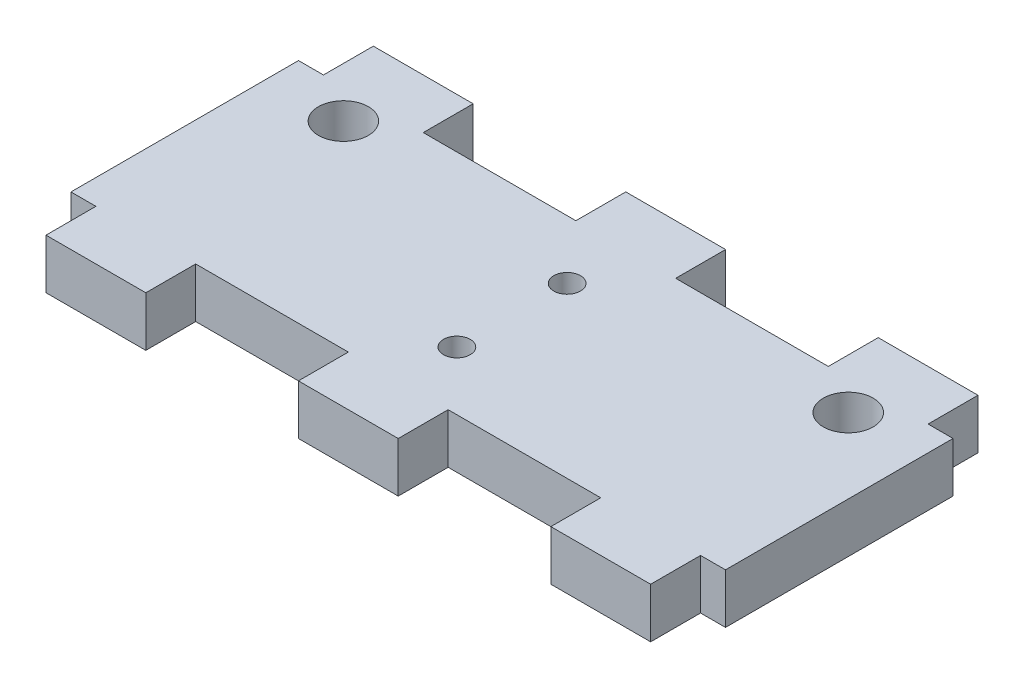
ISO-10303-21;
HEADER;
FILE_DESCRIPTION(('STEP AP214'),'2;1');
FILE_NAME('part.step','',(''),(''),'','','');
FILE_SCHEMA(('AUTOMOTIVE_DESIGN { 1 0 10303 214 1 1 1 1 }'));
ENDSEC;
DATA;
#1=APPLICATION_CONTEXT('core data for automotive mechanical design processes');
#2=APPLICATION_PROTOCOL_DEFINITION('international standard','automotive_design',2000,#1);
#3=PRODUCT_CONTEXT('',#1,'mechanical');
#4=PRODUCT('Part','Part','',(#3));
#5=PRODUCT_RELATED_PRODUCT_CATEGORY('part','',(#4));
#6=PRODUCT_DEFINITION_FORMATION('','',#4);
#7=PRODUCT_DEFINITION_CONTEXT('part definition',#1,'design');
#8=PRODUCT_DEFINITION('design','',#6,#7);
#9=PRODUCT_DEFINITION_SHAPE('','',#8);
#10=(LENGTH_UNIT() NAMED_UNIT(*) SI_UNIT(.MILLI.,.METRE.));
#11=(NAMED_UNIT(*) PLANE_ANGLE_UNIT() SI_UNIT($,.RADIAN.));
#12=(NAMED_UNIT(*) SI_UNIT($,.STERADIAN.) SOLID_ANGLE_UNIT());
#13=UNCERTAINTY_MEASURE_WITH_UNIT(LENGTH_MEASURE(1.E-05),#10,'distance_accuracy_value','');
#14=(GEOMETRIC_REPRESENTATION_CONTEXT(3) GLOBAL_UNCERTAINTY_ASSIGNED_CONTEXT((#13)) GLOBAL_UNIT_ASSIGNED_CONTEXT((#10,
#11,#12)) REPRESENTATION_CONTEXT('',''));
#15=CARTESIAN_POINT('',(0.,0.,0.));
#16=DIRECTION('',(0.,0.,1.));
#17=DIRECTION('',(1.,0.,0.));
#18=AXIS2_PLACEMENT_3D('',#15,#16,#17);
#19=CARTESIAN_POINT('',(0.,6.35,0.));
#20=DIRECTION('',(0.,-1.,0.));
#21=DIRECTION('',(0.,0.,-1.));
#22=AXIS2_PLACEMENT_3D('',#19,#20,#21);
#23=PLANE('',#22);
#24=CARTESIAN_POINT('',(-32.12084,6.35,-10.668));
#25=DIRECTION('',(0.,1.,0.));
#26=DIRECTION('',(0.,0.,1.));
#27=AXIS2_PLACEMENT_3D('',#24,#25,#26);
#28=CIRCLE('',#27,3.175);
#29=CARTESIAN_POINT('',(-32.12084,6.35,-7.493));
#30=VERTEX_POINT('',#29);
#31=EDGE_CURVE('E500',#30,#30,#28,.T.);
#32=ORIENTED_EDGE('',*,*,#31,.F.);
#33=EDGE_LOOP('',(#32));
#34=FACE_BOUND('',#33,.T.);
#35=CARTESIAN_POINT('',(0.,6.35,-7.01548000000001));
#36=DIRECTION('',(0.,1.,0.));
#37=DIRECTION('',(0.,0.,1.));
#38=AXIS2_PLACEMENT_3D('',#35,#36,#37);
#39=CIRCLE('',#38,1.70053);
#40=CARTESIAN_POINT('',(0.,6.35,-5.31495000000001));
#41=VERTEX_POINT('',#40);
#42=EDGE_CURVE('E254',#41,#41,#39,.T.);
#43=ORIENTED_EDGE('',*,*,#42,.F.);
#44=EDGE_LOOP('',(#43));
#45=FACE_BOUND('',#44,.T.);
#46=DIRECTION('',(0.,0.,1.));
#47=VECTOR('',#46,1.);
#48=CARTESIAN_POINT('',(-41.64584,6.35,14.478));
#49=LINE('',#48,#47);
#50=CARTESIAN_POINT('',(-41.64584,6.35,-14.478));
#51=VERTEX_POINT('',#50);
#52=CARTESIAN_POINT('',(-41.64584,6.35,14.478));
#53=VERTEX_POINT('',#52);
#54=EDGE_CURVE('E305',#51,#53,#49,.T.);
#55=ORIENTED_EDGE('',*,*,#54,.T.);
#56=DIRECTION('',(1.,0.,0.));
#57=VECTOR('',#56,1.);
#58=CARTESIAN_POINT('',(-41.64584,6.35,14.478));
#59=LINE('',#58,#57);
#60=CARTESIAN_POINT('',(-38.47084,6.35,14.478));
#61=VERTEX_POINT('',#60);
#62=EDGE_CURVE('E153',#53,#61,#59,.T.);
#63=ORIENTED_EDGE('',*,*,#62,.T.);
#64=DIRECTION('',(0.,0.,1.));
#65=VECTOR('',#64,1.);
#66=CARTESIAN_POINT('',(-38.47084,6.35,14.478));
#67=LINE('',#66,#65);
#68=CARTESIAN_POINT('',(-38.47084,6.35,20.828));
#69=VERTEX_POINT('',#68);
#70=EDGE_CURVE('E380',#61,#69,#67,.T.);
#71=ORIENTED_EDGE('',*,*,#70,.T.);
#72=DIRECTION('',(1.,0.,0.));
#73=VECTOR('',#72,1.);
#74=CARTESIAN_POINT('',(-38.47084,6.35,20.828));
#75=LINE('',#74,#73);
#76=CARTESIAN_POINT('',(-25.77084,6.35,20.828));
#77=VERTEX_POINT('',#76);
#78=EDGE_CURVE('E399',#69,#77,#75,.T.);
#79=ORIENTED_EDGE('',*,*,#78,.T.);
#80=DIRECTION('',(0.,0.,-1.));
#81=VECTOR('',#80,1.);
#82=CARTESIAN_POINT('',(-25.77084,6.35,20.828));
#83=LINE('',#82,#81);
#84=CARTESIAN_POINT('',(-25.77084,6.35,14.478));
#85=VERTEX_POINT('',#84);
#86=EDGE_CURVE('E396',#77,#85,#83,.T.);
#87=ORIENTED_EDGE('',*,*,#86,.T.);
#88=DIRECTION('',(1.,0.,0.));
#89=VECTOR('',#88,1.);
#90=CARTESIAN_POINT('',(-25.77084,6.35,14.478));
#91=LINE('',#90,#89);
#92=CARTESIAN_POINT('',(-6.35,6.35,14.478));
#93=VERTEX_POINT('',#92);
#94=EDGE_CURVE('E398',#85,#93,#91,.T.);
#95=ORIENTED_EDGE('',*,*,#94,.T.);
#96=DIRECTION('',(0.,0.,1.));
#97=VECTOR('',#96,1.);
#98=CARTESIAN_POINT('',(-6.35,6.35,14.478));
#99=LINE('',#98,#97);
#100=CARTESIAN_POINT('',(-6.34999999999999,6.35,20.828));
#101=VERTEX_POINT('',#100);
#102=EDGE_CURVE('E401',#93,#101,#99,.T.);
#103=ORIENTED_EDGE('',*,*,#102,.T.);
#104=DIRECTION('',(1.,0.,0.));
#105=VECTOR('',#104,1.);
#106=CARTESIAN_POINT('',(-6.34999999999999,6.35,20.828));
#107=LINE('',#106,#105);
#108=CARTESIAN_POINT('',(6.35,6.35,20.828));
#109=VERTEX_POINT('',#108);
#110=EDGE_CURVE('E407',#101,#109,#107,.T.);
#111=ORIENTED_EDGE('',*,*,#110,.T.);
#112=DIRECTION('',(0.,0.,-1.));
#113=VECTOR('',#112,1.);
#114=CARTESIAN_POINT('',(6.35,6.35,20.828));
#115=LINE('',#114,#113);
#116=CARTESIAN_POINT('',(6.35,6.35,14.478));
#117=VERTEX_POINT('',#116);
#118=EDGE_CURVE('E409',#109,#117,#115,.T.);
#119=ORIENTED_EDGE('',*,*,#118,.T.);
#120=DIRECTION('',(1.,0.,0.));
#121=VECTOR('',#120,1.);
#122=CARTESIAN_POINT('',(6.35,6.35,14.478));
#123=LINE('',#122,#121);
#124=CARTESIAN_POINT('',(25.77084,6.35,14.478));
#125=VERTEX_POINT('',#124);
#126=EDGE_CURVE('E411',#117,#125,#123,.T.);
#127=ORIENTED_EDGE('',*,*,#126,.T.);
#128=DIRECTION('',(0.,0.,1.));
#129=VECTOR('',#128,1.);
#130=CARTESIAN_POINT('',(25.77084,6.35,14.478));
#131=LINE('',#130,#129);
#132=CARTESIAN_POINT('',(25.77084,6.35,20.828));
#133=VERTEX_POINT('',#132);
#134=EDGE_CURVE('E413',#125,#133,#131,.T.);
#135=ORIENTED_EDGE('',*,*,#134,.T.);
#136=DIRECTION('',(1.,0.,0.));
#137=VECTOR('',#136,1.);
#138=CARTESIAN_POINT('',(25.77084,6.35,20.828));
#139=LINE('',#138,#137);
#140=CARTESIAN_POINT('',(38.47084,6.35,20.828));
#141=VERTEX_POINT('',#140);
#142=EDGE_CURVE('E415',#133,#141,#139,.T.);
#143=ORIENTED_EDGE('',*,*,#142,.T.);
#144=DIRECTION('',(0.,0.,-1.));
#145=VECTOR('',#144,1.);
#146=CARTESIAN_POINT('',(38.47084,6.35,20.828));
#147=LINE('',#146,#145);
#148=CARTESIAN_POINT('',(38.47084,6.35,14.478));
#149=VERTEX_POINT('',#148);
#150=EDGE_CURVE('E417',#141,#149,#147,.T.);
#151=ORIENTED_EDGE('',*,*,#150,.T.);
#152=DIRECTION('',(1.,0.,0.));
#153=VECTOR('',#152,1.);
#154=CARTESIAN_POINT('',(38.47084,6.35,14.478));
#155=LINE('',#154,#153);
#156=CARTESIAN_POINT('',(41.64584,6.35,14.478));
#157=VERTEX_POINT('',#156);
#158=EDGE_CURVE('E419',#149,#157,#155,.T.);
#159=ORIENTED_EDGE('',*,*,#158,.T.);
#160=DIRECTION('',(0.,0.,-1.));
#161=VECTOR('',#160,1.);
#162=CARTESIAN_POINT('',(41.64584,6.35,14.478));
#163=LINE('',#162,#161);
#164=CARTESIAN_POINT('',(41.64584,6.35,-14.478));
#165=VERTEX_POINT('',#164);
#166=EDGE_CURVE('E421',#157,#165,#163,.T.);
#167=ORIENTED_EDGE('',*,*,#166,.T.);
#168=DIRECTION('',(-1.,0.,0.));
#169=VECTOR('',#168,1.);
#170=CARTESIAN_POINT('',(38.47084,6.35,-14.478));
#171=LINE('',#170,#169);
#172=CARTESIAN_POINT('',(38.47084,6.35,-14.478));
#173=VERTEX_POINT('',#172);
#174=EDGE_CURVE('E423',#165,#173,#171,.T.);
#175=ORIENTED_EDGE('',*,*,#174,.T.);
#176=DIRECTION('',(0.,0.,-1.));
#177=VECTOR('',#176,1.);
#178=CARTESIAN_POINT('',(38.47084,6.35,-20.828));
#179=LINE('',#178,#177);
#180=CARTESIAN_POINT('',(38.47084,6.35,-20.828));
#181=VERTEX_POINT('',#180);
#182=EDGE_CURVE('E425',#173,#181,#179,.T.);
#183=ORIENTED_EDGE('',*,*,#182,.T.);
#184=DIRECTION('',(-1.,0.,0.));
#185=VECTOR('',#184,1.);
#186=CARTESIAN_POINT('',(25.77084,6.35,-20.828));
#187=LINE('',#186,#185);
#188=CARTESIAN_POINT('',(25.77084,6.35,-20.828));
#189=VERTEX_POINT('',#188);
#190=EDGE_CURVE('E427',#181,#189,#187,.T.);
#191=ORIENTED_EDGE('',*,*,#190,.T.);
#192=DIRECTION('',(0.,0.,1.));
#193=VECTOR('',#192,1.);
#194=CARTESIAN_POINT('',(25.77084,6.35,-14.478));
#195=LINE('',#194,#193);
#196=CARTESIAN_POINT('',(25.77084,6.35,-14.478));
#197=VERTEX_POINT('',#196);
#198=EDGE_CURVE('E429',#189,#197,#195,.T.);
#199=ORIENTED_EDGE('',*,*,#198,.T.);
#200=DIRECTION('',(-1.,0.,0.));
#201=VECTOR('',#200,1.);
#202=CARTESIAN_POINT('',(6.35,6.35,-14.478));
#203=LINE('',#202,#201);
#204=CARTESIAN_POINT('',(6.35,6.35,-14.478));
#205=VERTEX_POINT('',#204);
#206=EDGE_CURVE('E431',#197,#205,#203,.T.);
#207=ORIENTED_EDGE('',*,*,#206,.T.);
#208=DIRECTION('',(0.,0.,-1.));
#209=VECTOR('',#208,1.);
#210=CARTESIAN_POINT('',(6.34999999999999,6.35,-20.828));
#211=LINE('',#210,#209);
#212=CARTESIAN_POINT('',(6.34999999999999,6.35,-20.828));
#213=VERTEX_POINT('',#212);
#214=EDGE_CURVE('E433',#205,#213,#211,.T.);
#215=ORIENTED_EDGE('',*,*,#214,.T.);
#216=DIRECTION('',(-1.,0.,0.));
#217=VECTOR('',#216,1.);
#218=CARTESIAN_POINT('',(-6.34999999999999,6.35,-20.828));
#219=LINE('',#218,#217);
#220=CARTESIAN_POINT('',(-6.34999999999999,6.35,-20.828));
#221=VERTEX_POINT('',#220);
#222=EDGE_CURVE('E435',#213,#221,#219,.T.);
#223=ORIENTED_EDGE('',*,*,#222,.T.);
#224=DIRECTION('',(0.,0.,1.));
#225=VECTOR('',#224,1.);
#226=CARTESIAN_POINT('',(-6.35,6.35,-14.478));
#227=LINE('',#226,#225);
#228=CARTESIAN_POINT('',(-6.35,6.35,-14.478));
#229=VERTEX_POINT('',#228);
#230=EDGE_CURVE('E437',#221,#229,#227,.T.);
#231=ORIENTED_EDGE('',*,*,#230,.T.);
#232=DIRECTION('',(-1.,0.,0.));
#233=VECTOR('',#232,1.);
#234=CARTESIAN_POINT('',(-25.77084,6.35,-14.478));
#235=LINE('',#234,#233);
#236=CARTESIAN_POINT('',(-25.77084,6.35,-14.478));
#237=VERTEX_POINT('',#236);
#238=EDGE_CURVE('E439',#229,#237,#235,.T.);
#239=ORIENTED_EDGE('',*,*,#238,.T.);
#240=DIRECTION('',(0.,0.,-1.));
#241=VECTOR('',#240,1.);
#242=CARTESIAN_POINT('',(-25.77084,6.35,-20.828));
#243=LINE('',#242,#241);
#244=CARTESIAN_POINT('',(-25.77084,6.35,-20.828));
#245=VERTEX_POINT('',#244);
#246=EDGE_CURVE('E232',#237,#245,#243,.T.);
#247=ORIENTED_EDGE('',*,*,#246,.T.);
#248=DIRECTION('',(-1.,0.,0.));
#249=VECTOR('',#248,1.);
#250=CARTESIAN_POINT('',(-38.47084,6.35,-20.828));
#251=LINE('',#250,#249);
#252=CARTESIAN_POINT('',(-38.47084,6.35,-20.828));
#253=VERTEX_POINT('',#252);
#254=EDGE_CURVE('E226',#245,#253,#251,.T.);
#255=ORIENTED_EDGE('',*,*,#254,.T.);
#256=DIRECTION('',(0.,0.,1.));
#257=VECTOR('',#256,1.);
#258=CARTESIAN_POINT('',(-38.47084,6.35,-14.478));
#259=LINE('',#258,#257);
#260=CARTESIAN_POINT('',(-38.47084,6.35,-14.478));
#261=VERTEX_POINT('',#260);
#262=EDGE_CURVE('E230',#253,#261,#259,.T.);
#263=ORIENTED_EDGE('',*,*,#262,.T.);
#264=DIRECTION('',(-1.,0.,0.));
#265=VECTOR('',#264,1.);
#266=CARTESIAN_POINT('',(-41.64584,6.35,-14.478));
#267=LINE('',#266,#265);
#268=EDGE_CURVE('E50',#261,#51,#267,.T.);
#269=ORIENTED_EDGE('',*,*,#268,.T.);
#270=EDGE_LOOP('',(#55,#63,#71,#79,#87,#95,#103,#111,#119,#127,#135,#143,#151,#159,#167,#175,
#183,#191,#199,#207,#215,#223,#231,#239,#247,#255,#263,#269));
#271=FACE_BOUND('',#270,.T.);
#272=CARTESIAN_POINT('',(32.12084,6.35,-10.668));
#273=DIRECTION('',(0.,1.,0.));
#274=DIRECTION('',(0.,0.,1.));
#275=AXIS2_PLACEMENT_3D('',#272,#273,#274);
#276=CIRCLE('',#275,3.17500000000001);
#277=CARTESIAN_POINT('',(32.12084,6.35,-7.493));
#278=VERTEX_POINT('',#277);
#279=EDGE_CURVE('E506',#278,#278,#276,.T.);
#280=ORIENTED_EDGE('',*,*,#279,.F.);
#281=EDGE_LOOP('',(#280));
#282=FACE_BOUND('',#281,.T.);
#283=CARTESIAN_POINT('',(0.,6.35,7.01547999999999));
#284=DIRECTION('',(0.,1.,0.));
#285=DIRECTION('',(0.,0.,1.));
#286=AXIS2_PLACEMENT_3D('',#283,#284,#285);
#287=CIRCLE('',#286,1.70053);
#288=CARTESIAN_POINT('',(0.,6.35,8.71600999999999));
#289=VERTEX_POINT('',#288);
#290=EDGE_CURVE('E491',#289,#289,#287,.T.);
#291=ORIENTED_EDGE('',*,*,#290,.F.);
#292=EDGE_LOOP('',(#291));
#293=FACE_BOUND('',#292,.T.);
#294=ADVANCED_FACE('F33',(#34,#45,#271,#282,#293),#23,.F.);
#295=CARTESIAN_POINT('',(0.,0.,0.));
#296=DIRECTION('',(0.,-1.,0.));
#297=DIRECTION('',(0.,0.,-1.));
#298=AXIS2_PLACEMENT_3D('',#295,#296,#297);
#299=PLANE('',#298);
#300=CARTESIAN_POINT('',(-32.12084,0.,-10.668));
#301=DIRECTION('',(0.,1.,0.));
#302=DIRECTION('',(0.,0.,1.));
#303=AXIS2_PLACEMENT_3D('',#300,#301,#302);
#304=CIRCLE('',#303,3.175);
#305=CARTESIAN_POINT('',(-32.12084,0.,-7.493));
#306=VERTEX_POINT('',#305);
#307=EDGE_CURVE('E497',#306,#306,#304,.T.);
#308=ORIENTED_EDGE('',*,*,#307,.T.);
#309=EDGE_LOOP('',(#308));
#310=FACE_BOUND('',#309,.T.);
#311=CARTESIAN_POINT('',(0.,0.,-7.01548000000001));
#312=DIRECTION('',(0.,1.,0.));
#313=DIRECTION('',(0.,0.,1.));
#314=AXIS2_PLACEMENT_3D('',#311,#312,#313);
#315=CIRCLE('',#314,1.70053);
#316=CARTESIAN_POINT('',(0.,0.,-5.31495000000001));
#317=VERTEX_POINT('',#316);
#318=EDGE_CURVE('E509',#317,#317,#315,.T.);
#319=ORIENTED_EDGE('',*,*,#318,.T.);
#320=EDGE_LOOP('',(#319));
#321=FACE_BOUND('',#320,.T.);
#322=DIRECTION('',(0.,0.,1.));
#323=VECTOR('',#322,1.);
#324=CARTESIAN_POINT('',(-41.64584,0.,14.478));
#325=LINE('',#324,#323);
#326=CARTESIAN_POINT('',(-41.64584,0.,-14.478));
#327=VERTEX_POINT('',#326);
#328=CARTESIAN_POINT('',(-41.64584,0.,14.478));
#329=VERTEX_POINT('',#328);
#330=EDGE_CURVE('E250',#327,#329,#325,.T.);
#331=ORIENTED_EDGE('',*,*,#330,.F.);
#332=DIRECTION('',(-1.,0.,0.));
#333=VECTOR('',#332,1.);
#334=CARTESIAN_POINT('',(-41.64584,0.,-14.478));
#335=LINE('',#334,#333);
#336=CARTESIAN_POINT('',(-38.47084,0.,-14.478));
#337=VERTEX_POINT('',#336);
#338=EDGE_CURVE('E145',#337,#327,#335,.T.);
#339=ORIENTED_EDGE('',*,*,#338,.F.);
#340=DIRECTION('',(0.,0.,1.));
#341=VECTOR('',#340,1.);
#342=CARTESIAN_POINT('',(-38.47084,0.,-14.478));
#343=LINE('',#342,#341);
#344=CARTESIAN_POINT('',(-38.47084,0.,-20.828));
#345=VERTEX_POINT('',#344);
#346=EDGE_CURVE('E139',#345,#337,#343,.T.);
#347=ORIENTED_EDGE('',*,*,#346,.F.);
#348=DIRECTION('',(-1.,0.,0.));
#349=VECTOR('',#348,1.);
#350=CARTESIAN_POINT('',(-38.47084,0.,-20.828));
#351=LINE('',#350,#349);
#352=CARTESIAN_POINT('',(-25.77084,0.,-20.828));
#353=VERTEX_POINT('',#352);
#354=EDGE_CURVE('E240',#353,#345,#351,.T.);
#355=ORIENTED_EDGE('',*,*,#354,.F.);
#356=DIRECTION('',(0.,0.,-1.));
#357=VECTOR('',#356,1.);
#358=CARTESIAN_POINT('',(-25.77084,0.,-20.828));
#359=LINE('',#358,#357);
#360=CARTESIAN_POINT('',(-25.77084,0.,-14.478));
#361=VERTEX_POINT('',#360);
#362=EDGE_CURVE('E300',#361,#353,#359,.T.);
#363=ORIENTED_EDGE('',*,*,#362,.F.);
#364=DIRECTION('',(-1.,0.,0.));
#365=VECTOR('',#364,1.);
#366=CARTESIAN_POINT('',(-25.77084,0.,-14.478));
#367=LINE('',#366,#365);
#368=CARTESIAN_POINT('',(-6.35,0.,-14.478));
#369=VERTEX_POINT('',#368);
#370=EDGE_CURVE('E298',#369,#361,#367,.T.);
#371=ORIENTED_EDGE('',*,*,#370,.F.);
#372=DIRECTION('',(0.,0.,1.));
#373=VECTOR('',#372,1.);
#374=CARTESIAN_POINT('',(-6.35,0.,-14.478));
#375=LINE('',#374,#373);
#376=CARTESIAN_POINT('',(-6.34999999999999,0.,-20.828));
#377=VERTEX_POINT('',#376);
#378=EDGE_CURVE('E296',#377,#369,#375,.T.);
#379=ORIENTED_EDGE('',*,*,#378,.F.);
#380=DIRECTION('',(-1.,0.,0.));
#381=VECTOR('',#380,1.);
#382=CARTESIAN_POINT('',(-6.34999999999999,0.,-20.828));
#383=LINE('',#382,#381);
#384=CARTESIAN_POINT('',(6.34999999999999,0.,-20.828));
#385=VERTEX_POINT('',#384);
#386=EDGE_CURVE('E294',#385,#377,#383,.T.);
#387=ORIENTED_EDGE('',*,*,#386,.F.);
#388=DIRECTION('',(0.,0.,-1.));
#389=VECTOR('',#388,1.);
#390=CARTESIAN_POINT('',(6.34999999999999,0.,-20.828));
#391=LINE('',#390,#389);
#392=CARTESIAN_POINT('',(6.35,0.,-14.478));
#393=VERTEX_POINT('',#392);
#394=EDGE_CURVE('E292',#393,#385,#391,.T.);
#395=ORIENTED_EDGE('',*,*,#394,.F.);
#396=DIRECTION('',(-1.,0.,0.));
#397=VECTOR('',#396,1.);
#398=CARTESIAN_POINT('',(6.35,0.,-14.478));
#399=LINE('',#398,#397);
#400=CARTESIAN_POINT('',(25.77084,0.,-14.478));
#401=VERTEX_POINT('',#400);
#402=EDGE_CURVE('E290',#401,#393,#399,.T.);
#403=ORIENTED_EDGE('',*,*,#402,.F.);
#404=DIRECTION('',(0.,0.,1.));
#405=VECTOR('',#404,1.);
#406=CARTESIAN_POINT('',(25.77084,0.,-14.478));
#407=LINE('',#406,#405);
#408=CARTESIAN_POINT('',(25.77084,0.,-20.828));
#409=VERTEX_POINT('',#408);
#410=EDGE_CURVE('E288',#409,#401,#407,.T.);
#411=ORIENTED_EDGE('',*,*,#410,.F.);
#412=DIRECTION('',(-1.,0.,0.));
#413=VECTOR('',#412,1.);
#414=CARTESIAN_POINT('',(25.77084,0.,-20.828));
#415=LINE('',#414,#413);
#416=CARTESIAN_POINT('',(38.47084,0.,-20.828));
#417=VERTEX_POINT('',#416);
#418=EDGE_CURVE('E286',#417,#409,#415,.T.);
#419=ORIENTED_EDGE('',*,*,#418,.F.);
#420=DIRECTION('',(0.,0.,-1.));
#421=VECTOR('',#420,1.);
#422=CARTESIAN_POINT('',(38.47084,0.,-20.828));
#423=LINE('',#422,#421);
#424=CARTESIAN_POINT('',(38.47084,0.,-14.478));
#425=VERTEX_POINT('',#424);
#426=EDGE_CURVE('E284',#425,#417,#423,.T.);
#427=ORIENTED_EDGE('',*,*,#426,.F.);
#428=DIRECTION('',(-1.,0.,0.));
#429=VECTOR('',#428,1.);
#430=CARTESIAN_POINT('',(38.47084,0.,-14.478));
#431=LINE('',#430,#429);
#432=CARTESIAN_POINT('',(41.64584,0.,-14.478));
#433=VERTEX_POINT('',#432);
#434=EDGE_CURVE('E282',#433,#425,#431,.T.);
#435=ORIENTED_EDGE('',*,*,#434,.F.);
#436=DIRECTION('',(0.,0.,-1.));
#437=VECTOR('',#436,1.);
#438=CARTESIAN_POINT('',(41.64584,0.,14.478));
#439=LINE('',#438,#437);
#440=CARTESIAN_POINT('',(41.64584,0.,14.478));
#441=VERTEX_POINT('',#440);
#442=EDGE_CURVE('E280',#441,#433,#439,.T.);
#443=ORIENTED_EDGE('',*,*,#442,.F.);
#444=DIRECTION('',(1.,0.,0.));
#445=VECTOR('',#444,1.);
#446=CARTESIAN_POINT('',(38.47084,0.,14.478));
#447=LINE('',#446,#445);
#448=CARTESIAN_POINT('',(38.47084,0.,14.478));
#449=VERTEX_POINT('',#448);
#450=EDGE_CURVE('E278',#449,#441,#447,.T.);
#451=ORIENTED_EDGE('',*,*,#450,.F.);
#452=DIRECTION('',(0.,0.,-1.));
#453=VECTOR('',#452,1.);
#454=CARTESIAN_POINT('',(38.47084,0.,20.828));
#455=LINE('',#454,#453);
#456=CARTESIAN_POINT('',(38.47084,0.,20.828));
#457=VERTEX_POINT('',#456);
#458=EDGE_CURVE('E276',#457,#449,#455,.T.);
#459=ORIENTED_EDGE('',*,*,#458,.F.);
#460=DIRECTION('',(1.,0.,0.));
#461=VECTOR('',#460,1.);
#462=CARTESIAN_POINT('',(25.77084,0.,20.828));
#463=LINE('',#462,#461);
#464=CARTESIAN_POINT('',(25.77084,0.,20.828));
#465=VERTEX_POINT('',#464);
#466=EDGE_CURVE('E274',#465,#457,#463,.T.);
#467=ORIENTED_EDGE('',*,*,#466,.F.);
#468=DIRECTION('',(0.,0.,1.));
#469=VECTOR('',#468,1.);
#470=CARTESIAN_POINT('',(25.77084,0.,14.478));
#471=LINE('',#470,#469);
#472=CARTESIAN_POINT('',(25.77084,0.,14.478));
#473=VERTEX_POINT('',#472);
#474=EDGE_CURVE('E272',#473,#465,#471,.T.);
#475=ORIENTED_EDGE('',*,*,#474,.F.);
#476=DIRECTION('',(1.,0.,0.));
#477=VECTOR('',#476,1.);
#478=CARTESIAN_POINT('',(6.35,0.,14.478));
#479=LINE('',#478,#477);
#480=CARTESIAN_POINT('',(6.35,0.,14.478));
#481=VERTEX_POINT('',#480);
#482=EDGE_CURVE('E270',#481,#473,#479,.T.);
#483=ORIENTED_EDGE('',*,*,#482,.F.);
#484=DIRECTION('',(0.,0.,-1.));
#485=VECTOR('',#484,1.);
#486=CARTESIAN_POINT('',(6.35,0.,20.828));
#487=LINE('',#486,#485);
#488=CARTESIAN_POINT('',(6.35,0.,20.828));
#489=VERTEX_POINT('',#488);
#490=EDGE_CURVE('E268',#489,#481,#487,.T.);
#491=ORIENTED_EDGE('',*,*,#490,.F.);
#492=DIRECTION('',(1.,0.,0.));
#493=VECTOR('',#492,1.);
#494=CARTESIAN_POINT('',(-6.34999999999999,0.,20.828));
#495=LINE('',#494,#493);
#496=CARTESIAN_POINT('',(-6.34999999999999,0.,20.828));
#497=VERTEX_POINT('',#496);
#498=EDGE_CURVE('E266',#497,#489,#495,.T.);
#499=ORIENTED_EDGE('',*,*,#498,.F.);
#500=DIRECTION('',(0.,0.,1.));
#501=VECTOR('',#500,1.);
#502=CARTESIAN_POINT('',(-6.35,0.,14.478));
#503=LINE('',#502,#501);
#504=CARTESIAN_POINT('',(-6.35,0.,14.478));
#505=VERTEX_POINT('',#504);
#506=EDGE_CURVE('E264',#505,#497,#503,.T.);
#507=ORIENTED_EDGE('',*,*,#506,.F.);
#508=DIRECTION('',(1.,0.,0.));
#509=VECTOR('',#508,1.);
#510=CARTESIAN_POINT('',(-25.77084,0.,14.478));
#511=LINE('',#510,#509);
#512=CARTESIAN_POINT('',(-25.77084,0.,14.478));
#513=VERTEX_POINT('',#512);
#514=EDGE_CURVE('E262',#513,#505,#511,.T.);
#515=ORIENTED_EDGE('',*,*,#514,.F.);
#516=DIRECTION('',(0.,0.,-1.));
#517=VECTOR('',#516,1.);
#518=CARTESIAN_POINT('',(-25.77084,0.,20.828));
#519=LINE('',#518,#517);
#520=CARTESIAN_POINT('',(-25.77084,0.,20.828));
#521=VERTEX_POINT('',#520);
#522=EDGE_CURVE('E260',#521,#513,#519,.T.);
#523=ORIENTED_EDGE('',*,*,#522,.F.);
#524=DIRECTION('',(1.,0.,0.));
#525=VECTOR('',#524,1.);
#526=CARTESIAN_POINT('',(-38.47084,0.,20.828));
#527=LINE('',#526,#525);
#528=CARTESIAN_POINT('',(-38.47084,0.,20.828));
#529=VERTEX_POINT('',#528);
#530=EDGE_CURVE('E258',#529,#521,#527,.T.);
#531=ORIENTED_EDGE('',*,*,#530,.F.);
#532=DIRECTION('',(0.,0.,1.));
#533=VECTOR('',#532,1.);
#534=CARTESIAN_POINT('',(-38.47084,0.,14.478));
#535=LINE('',#534,#533);
#536=CARTESIAN_POINT('',(-38.47084,0.,14.478));
#537=VERTEX_POINT('',#536);
#538=EDGE_CURVE('E256',#537,#529,#535,.T.);
#539=ORIENTED_EDGE('',*,*,#538,.F.);
#540=DIRECTION('',(1.,0.,0.));
#541=VECTOR('',#540,1.);
#542=CARTESIAN_POINT('',(-41.64584,0.,14.478));
#543=LINE('',#542,#541);
#544=EDGE_CURVE('E253',#329,#537,#543,.T.);
#545=ORIENTED_EDGE('',*,*,#544,.F.);
#546=EDGE_LOOP('',(#331,#339,#347,#355,#363,#371,#379,#387,#395,#403,#411,#419,#427,#435,#443,
#451,#459,#467,#475,#483,#491,#499,#507,#515,#523,#531,#539,#545));
#547=FACE_BOUND('',#546,.T.);
#548=CARTESIAN_POINT('',(32.12084,0.,-10.668));
#549=DIRECTION('',(0.,1.,0.));
#550=DIRECTION('',(0.,0.,1.));
#551=AXIS2_PLACEMENT_3D('',#548,#549,#550);
#552=CIRCLE('',#551,3.17500000000001);
#553=CARTESIAN_POINT('',(32.12084,0.,-7.493));
#554=VERTEX_POINT('',#553);
#555=EDGE_CURVE('E503',#554,#554,#552,.T.);
#556=ORIENTED_EDGE('',*,*,#555,.T.);
#557=EDGE_LOOP('',(#556));
#558=FACE_BOUND('',#557,.T.);
#559=CARTESIAN_POINT('',(0.,0.,7.01547999999999));
#560=DIRECTION('',(0.,1.,0.));
#561=DIRECTION('',(0.,0.,1.));
#562=AXIS2_PLACEMENT_3D('',#559,#560,#561);
#563=CIRCLE('',#562,1.70053);
#564=CARTESIAN_POINT('',(0.,0.,8.71600999999999));
#565=VERTEX_POINT('',#564);
#566=EDGE_CURVE('E494',#565,#565,#563,.T.);
#567=ORIENTED_EDGE('',*,*,#566,.T.);
#568=EDGE_LOOP('',(#567));
#569=FACE_BOUND('',#568,.T.);
#570=ADVANCED_FACE('F384',(#310,#321,#547,#558,#569),#299,.T.);
#571=CARTESIAN_POINT('',(-41.64584,6.35,14.478));
#572=DIRECTION('',(1.,0.,0.));
#573=DIRECTION('',(0.,0.,-1.));
#574=AXIS2_PLACEMENT_3D('',#571,#572,#573);
#575=PLANE('',#574);
#576=ORIENTED_EDGE('',*,*,#330,.T.);
#577=DIRECTION('',(0.,-1.,0.));
#578=VECTOR('',#577,1.);
#579=CARTESIAN_POINT('',(-41.64584,6.35,14.478));
#580=LINE('',#579,#578);
#581=EDGE_CURVE('E11',#53,#329,#580,.T.);
#582=ORIENTED_EDGE('',*,*,#581,.F.);
#583=ORIENTED_EDGE('',*,*,#54,.F.);
#584=DIRECTION('',(0.,-1.,0.));
#585=VECTOR('',#584,1.);
#586=CARTESIAN_POINT('',(-41.64584,6.35,-14.478));
#587=LINE('',#586,#585);
#588=EDGE_CURVE('E246',#51,#327,#587,.T.);
#589=ORIENTED_EDGE('',*,*,#588,.T.);
#590=EDGE_LOOP('',(#576,#582,#583,#589));
#591=FACE_BOUND('',#590,.T.);
#592=ADVANCED_FACE('F35',(#591),#575,.F.);
#593=CARTESIAN_POINT('',(-41.64584,6.35,14.478));
#594=DIRECTION('',(0.,0.,-1.));
#595=DIRECTION('',(-1.,0.,0.));
#596=AXIS2_PLACEMENT_3D('',#593,#594,#595);
#597=PLANE('',#596);
#598=ORIENTED_EDGE('',*,*,#544,.T.);
#599=DIRECTION('',(0.,-1.,0.));
#600=VECTOR('',#599,1.);
#601=CARTESIAN_POINT('',(-38.47084,6.35,14.478));
#602=LINE('',#601,#600);
#603=EDGE_CURVE('E42',#61,#537,#602,.T.);
#604=ORIENTED_EDGE('',*,*,#603,.F.);
#605=ORIENTED_EDGE('',*,*,#62,.F.);
#606=ORIENTED_EDGE('',*,*,#581,.T.);
#607=EDGE_LOOP('',(#598,#604,#605,#606));
#608=FACE_BOUND('',#607,.T.);
#609=ADVANCED_FACE('F778',(#608),#597,.F.);
#610=CARTESIAN_POINT('',(-38.47084,6.35,14.478));
#611=DIRECTION('',(1.,0.,0.));
#612=DIRECTION('',(0.,0.,-1.));
#613=AXIS2_PLACEMENT_3D('',#610,#611,#612);
#614=PLANE('',#613);
#615=ORIENTED_EDGE('',*,*,#538,.T.);
#616=DIRECTION('',(0.,-1.,0.));
#617=VECTOR('',#616,1.);
#618=CARTESIAN_POINT('',(-38.47084,6.35,20.828));
#619=LINE('',#618,#617);
#620=EDGE_CURVE('E372',#69,#529,#619,.T.);
#621=ORIENTED_EDGE('',*,*,#620,.F.);
#622=ORIENTED_EDGE('',*,*,#70,.F.);
#623=ORIENTED_EDGE('',*,*,#603,.T.);
#624=EDGE_LOOP('',(#615,#621,#622,#623));
#625=FACE_BOUND('',#624,.T.);
#626=ADVANCED_FACE('F378',(#625),#614,.F.);
#627=CARTESIAN_POINT('',(-38.47084,6.35,20.828));
#628=DIRECTION('',(0.,0.,-1.));
#629=DIRECTION('',(-1.,0.,0.));
#630=AXIS2_PLACEMENT_3D('',#627,#628,#629);
#631=PLANE('',#630);
#632=ORIENTED_EDGE('',*,*,#530,.T.);
#633=DIRECTION('',(0.,-1.,0.));
#634=VECTOR('',#633,1.);
#635=CARTESIAN_POINT('',(-25.77084,6.35,20.828));
#636=LINE('',#635,#634);
#637=EDGE_CURVE('E369',#77,#521,#636,.T.);
#638=ORIENTED_EDGE('',*,*,#637,.F.);
#639=ORIENTED_EDGE('',*,*,#78,.F.);
#640=ORIENTED_EDGE('',*,*,#620,.T.);
#641=EDGE_LOOP('',(#632,#638,#639,#640));
#642=FACE_BOUND('',#641,.T.);
#643=ADVANCED_FACE('F390',(#642),#631,.F.);
#644=CARTESIAN_POINT('',(-25.77084,6.35,20.828));
#645=DIRECTION('',(-1.,0.,0.));
#646=DIRECTION('',(0.,0.,1.));
#647=AXIS2_PLACEMENT_3D('',#644,#645,#646);
#648=PLANE('',#647);
#649=ORIENTED_EDGE('',*,*,#522,.T.);
#650=DIRECTION('',(0.,-1.,0.));
#651=VECTOR('',#650,1.);
#652=CARTESIAN_POINT('',(-25.77084,6.35,14.478));
#653=LINE('',#652,#651);
#654=EDGE_CURVE('E366',#85,#513,#653,.T.);
#655=ORIENTED_EDGE('',*,*,#654,.F.);
#656=ORIENTED_EDGE('',*,*,#86,.F.);
#657=ORIENTED_EDGE('',*,*,#637,.T.);
#658=EDGE_LOOP('',(#649,#655,#656,#657));
#659=FACE_BOUND('',#658,.T.);
#660=ADVANCED_FACE('F394',(#659),#648,.F.);
#661=CARTESIAN_POINT('',(-25.77084,6.35,14.478));
#662=DIRECTION('',(0.,0.,-1.));
#663=DIRECTION('',(-1.,0.,0.));
#664=AXIS2_PLACEMENT_3D('',#661,#662,#663);
#665=PLANE('',#664);
#666=ORIENTED_EDGE('',*,*,#514,.T.);
#667=DIRECTION('',(0.,-1.,0.));
#668=VECTOR('',#667,1.);
#669=CARTESIAN_POINT('',(-6.35,6.35,14.478));
#670=LINE('',#669,#668);
#671=EDGE_CURVE('E363',#93,#505,#670,.T.);
#672=ORIENTED_EDGE('',*,*,#671,.F.);
#673=ORIENTED_EDGE('',*,*,#94,.F.);
#674=ORIENTED_EDGE('',*,*,#654,.T.);
#675=EDGE_LOOP('',(#666,#672,#673,#674));
#676=FACE_BOUND('',#675,.T.);
#677=ADVANCED_FACE('F743',(#676),#665,.F.);
#678=CARTESIAN_POINT('',(-6.35,6.35,14.478));
#679=DIRECTION('',(1.,0.,0.));
#680=DIRECTION('',(0.,0.,-1.));
#681=AXIS2_PLACEMENT_3D('',#678,#679,#680);
#682=PLANE('',#681);
#683=ORIENTED_EDGE('',*,*,#506,.T.);
#684=DIRECTION('',(0.,-1.,0.));
#685=VECTOR('',#684,1.);
#686=CARTESIAN_POINT('',(-6.34999999999999,6.35,20.828));
#687=LINE('',#686,#685);
#688=EDGE_CURVE('E360',#101,#497,#687,.T.);
#689=ORIENTED_EDGE('',*,*,#688,.F.);
#690=ORIENTED_EDGE('',*,*,#102,.F.);
#691=ORIENTED_EDGE('',*,*,#671,.T.);
#692=EDGE_LOOP('',(#683,#689,#690,#691));
#693=FACE_BOUND('',#692,.T.);
#694=ADVANCED_FACE('F733',(#693),#682,.F.);
#695=CARTESIAN_POINT('',(-6.34999999999999,6.35,20.828));
#696=DIRECTION('',(0.,0.,-1.));
#697=DIRECTION('',(-1.,0.,0.));
#698=AXIS2_PLACEMENT_3D('',#695,#696,#697);
#699=PLANE('',#698);
#700=ORIENTED_EDGE('',*,*,#498,.T.);
#701=DIRECTION('',(0.,-1.,0.));
#702=VECTOR('',#701,1.);
#703=CARTESIAN_POINT('',(6.35,6.35,20.828));
#704=LINE('',#703,#702);
#705=EDGE_CURVE('E357',#109,#489,#704,.T.);
#706=ORIENTED_EDGE('',*,*,#705,.F.);
#707=ORIENTED_EDGE('',*,*,#110,.F.);
#708=ORIENTED_EDGE('',*,*,#688,.T.);
#709=EDGE_LOOP('',(#700,#706,#707,#708));
#710=FACE_BOUND('',#709,.T.);
#711=ADVANCED_FACE('F723',(#710),#699,.F.);
#712=CARTESIAN_POINT('',(6.35,6.35,20.828));
#713=DIRECTION('',(-1.,0.,0.));
#714=DIRECTION('',(0.,0.,1.));
#715=AXIS2_PLACEMENT_3D('',#712,#713,#714);
#716=PLANE('',#715);
#717=ORIENTED_EDGE('',*,*,#490,.T.);
#718=DIRECTION('',(0.,-1.,0.));
#719=VECTOR('',#718,1.);
#720=CARTESIAN_POINT('',(6.35,6.35,14.478));
#721=LINE('',#720,#719);
#722=EDGE_CURVE('E354',#117,#481,#721,.T.);
#723=ORIENTED_EDGE('',*,*,#722,.F.);
#724=ORIENTED_EDGE('',*,*,#118,.F.);
#725=ORIENTED_EDGE('',*,*,#705,.T.);
#726=EDGE_LOOP('',(#717,#723,#724,#725));
#727=FACE_BOUND('',#726,.T.);
#728=ADVANCED_FACE('F713',(#727),#716,.F.);
#729=CARTESIAN_POINT('',(6.35,6.35,14.478));
#730=DIRECTION('',(0.,0.,-1.));
#731=DIRECTION('',(-1.,0.,0.));
#732=AXIS2_PLACEMENT_3D('',#729,#730,#731);
#733=PLANE('',#732);
#734=ORIENTED_EDGE('',*,*,#482,.T.);
#735=DIRECTION('',(0.,-1.,0.));
#736=VECTOR('',#735,1.);
#737=CARTESIAN_POINT('',(25.77084,6.35,14.478));
#738=LINE('',#737,#736);
#739=EDGE_CURVE('E351',#125,#473,#738,.T.);
#740=ORIENTED_EDGE('',*,*,#739,.F.);
#741=ORIENTED_EDGE('',*,*,#126,.F.);
#742=ORIENTED_EDGE('',*,*,#722,.T.);
#743=EDGE_LOOP('',(#734,#740,#741,#742));
#744=FACE_BOUND('',#743,.T.);
#745=ADVANCED_FACE('F703',(#744),#733,.F.);
#746=CARTESIAN_POINT('',(25.77084,6.35,14.478));
#747=DIRECTION('',(1.,0.,0.));
#748=DIRECTION('',(0.,0.,-1.));
#749=AXIS2_PLACEMENT_3D('',#746,#747,#748);
#750=PLANE('',#749);
#751=ORIENTED_EDGE('',*,*,#474,.T.);
#752=DIRECTION('',(0.,-1.,0.));
#753=VECTOR('',#752,1.);
#754=CARTESIAN_POINT('',(25.77084,6.35,20.828));
#755=LINE('',#754,#753);
#756=EDGE_CURVE('E348',#133,#465,#755,.T.);
#757=ORIENTED_EDGE('',*,*,#756,.F.);
#758=ORIENTED_EDGE('',*,*,#134,.F.);
#759=ORIENTED_EDGE('',*,*,#739,.T.);
#760=EDGE_LOOP('',(#751,#757,#758,#759));
#761=FACE_BOUND('',#760,.T.);
#762=ADVANCED_FACE('F693',(#761),#750,.F.);
#763=CARTESIAN_POINT('',(25.77084,6.35,20.828));
#764=DIRECTION('',(0.,0.,-1.));
#765=DIRECTION('',(-1.,0.,0.));
#766=AXIS2_PLACEMENT_3D('',#763,#764,#765);
#767=PLANE('',#766);
#768=ORIENTED_EDGE('',*,*,#466,.T.);
#769=DIRECTION('',(0.,-1.,0.));
#770=VECTOR('',#769,1.);
#771=CARTESIAN_POINT('',(38.47084,6.35,20.828));
#772=LINE('',#771,#770);
#773=EDGE_CURVE('E345',#141,#457,#772,.T.);
#774=ORIENTED_EDGE('',*,*,#773,.F.);
#775=ORIENTED_EDGE('',*,*,#142,.F.);
#776=ORIENTED_EDGE('',*,*,#756,.T.);
#777=EDGE_LOOP('',(#768,#774,#775,#776));
#778=FACE_BOUND('',#777,.T.);
#779=ADVANCED_FACE('F683',(#778),#767,.F.);
#780=CARTESIAN_POINT('',(38.47084,6.35,20.828));
#781=DIRECTION('',(-1.,0.,0.));
#782=DIRECTION('',(0.,0.,1.));
#783=AXIS2_PLACEMENT_3D('',#780,#781,#782);
#784=PLANE('',#783);
#785=ORIENTED_EDGE('',*,*,#458,.T.);
#786=DIRECTION('',(0.,-1.,0.));
#787=VECTOR('',#786,1.);
#788=CARTESIAN_POINT('',(38.47084,6.35,14.478));
#789=LINE('',#788,#787);
#790=EDGE_CURVE('E342',#149,#449,#789,.T.);
#791=ORIENTED_EDGE('',*,*,#790,.F.);
#792=ORIENTED_EDGE('',*,*,#150,.F.);
#793=ORIENTED_EDGE('',*,*,#773,.T.);
#794=EDGE_LOOP('',(#785,#791,#792,#793));
#795=FACE_BOUND('',#794,.T.);
#796=ADVANCED_FACE('F673',(#795),#784,.F.);
#797=CARTESIAN_POINT('',(38.47084,6.35,14.478));
#798=DIRECTION('',(0.,0.,-1.));
#799=DIRECTION('',(-1.,0.,0.));
#800=AXIS2_PLACEMENT_3D('',#797,#798,#799);
#801=PLANE('',#800);
#802=ORIENTED_EDGE('',*,*,#450,.T.);
#803=DIRECTION('',(0.,-1.,0.));
#804=VECTOR('',#803,1.);
#805=CARTESIAN_POINT('',(41.64584,6.35,14.478));
#806=LINE('',#805,#804);
#807=EDGE_CURVE('E339',#157,#441,#806,.T.);
#808=ORIENTED_EDGE('',*,*,#807,.F.);
#809=ORIENTED_EDGE('',*,*,#158,.F.);
#810=ORIENTED_EDGE('',*,*,#790,.T.);
#811=EDGE_LOOP('',(#802,#808,#809,#810));
#812=FACE_BOUND('',#811,.T.);
#813=ADVANCED_FACE('F663',(#812),#801,.F.);
#814=CARTESIAN_POINT('',(41.64584,6.35,14.478));
#815=DIRECTION('',(-1.,0.,0.));
#816=DIRECTION('',(0.,0.,1.));
#817=AXIS2_PLACEMENT_3D('',#814,#815,#816);
#818=PLANE('',#817);
#819=ORIENTED_EDGE('',*,*,#442,.T.);
#820=DIRECTION('',(0.,-1.,0.));
#821=VECTOR('',#820,1.);
#822=CARTESIAN_POINT('',(41.64584,6.35,-14.478));
#823=LINE('',#822,#821);
#824=EDGE_CURVE('E336',#165,#433,#823,.T.);
#825=ORIENTED_EDGE('',*,*,#824,.F.);
#826=ORIENTED_EDGE('',*,*,#166,.F.);
#827=ORIENTED_EDGE('',*,*,#807,.T.);
#828=EDGE_LOOP('',(#819,#825,#826,#827));
#829=FACE_BOUND('',#828,.T.);
#830=ADVANCED_FACE('F653',(#829),#818,.F.);
#831=CARTESIAN_POINT('',(38.47084,6.35,-14.478));
#832=DIRECTION('',(0.,0.,1.));
#833=DIRECTION('',(1.,0.,0.));
#834=AXIS2_PLACEMENT_3D('',#831,#832,#833);
#835=PLANE('',#834);
#836=ORIENTED_EDGE('',*,*,#434,.T.);
#837=DIRECTION('',(0.,-1.,0.));
#838=VECTOR('',#837,1.);
#839=CARTESIAN_POINT('',(38.47084,6.35,-14.478));
#840=LINE('',#839,#838);
#841=EDGE_CURVE('E333',#173,#425,#840,.T.);
#842=ORIENTED_EDGE('',*,*,#841,.F.);
#843=ORIENTED_EDGE('',*,*,#174,.F.);
#844=ORIENTED_EDGE('',*,*,#824,.T.);
#845=EDGE_LOOP('',(#836,#842,#843,#844));
#846=FACE_BOUND('',#845,.T.);
#847=ADVANCED_FACE('F643',(#846),#835,.F.);
#848=CARTESIAN_POINT('',(38.47084,6.35,-20.828));
#849=DIRECTION('',(-1.,0.,0.));
#850=DIRECTION('',(0.,0.,1.));
#851=AXIS2_PLACEMENT_3D('',#848,#849,#850);
#852=PLANE('',#851);
#853=ORIENTED_EDGE('',*,*,#426,.T.);
#854=DIRECTION('',(0.,-1.,0.));
#855=VECTOR('',#854,1.);
#856=CARTESIAN_POINT('',(38.47084,6.35,-20.828));
#857=LINE('',#856,#855);
#858=EDGE_CURVE('E330',#181,#417,#857,.T.);
#859=ORIENTED_EDGE('',*,*,#858,.F.);
#860=ORIENTED_EDGE('',*,*,#182,.F.);
#861=ORIENTED_EDGE('',*,*,#841,.T.);
#862=EDGE_LOOP('',(#853,#859,#860,#861));
#863=FACE_BOUND('',#862,.T.);
#864=ADVANCED_FACE('F633',(#863),#852,.F.);
#865=CARTESIAN_POINT('',(25.77084,6.35,-20.828));
#866=DIRECTION('',(0.,0.,1.));
#867=DIRECTION('',(1.,0.,0.));
#868=AXIS2_PLACEMENT_3D('',#865,#866,#867);
#869=PLANE('',#868);
#870=ORIENTED_EDGE('',*,*,#418,.T.);
#871=DIRECTION('',(0.,-1.,0.));
#872=VECTOR('',#871,1.);
#873=CARTESIAN_POINT('',(25.77084,6.35,-20.828));
#874=LINE('',#873,#872);
#875=EDGE_CURVE('E327',#189,#409,#874,.T.);
#876=ORIENTED_EDGE('',*,*,#875,.F.);
#877=ORIENTED_EDGE('',*,*,#190,.F.);
#878=ORIENTED_EDGE('',*,*,#858,.T.);
#879=EDGE_LOOP('',(#870,#876,#877,#878));
#880=FACE_BOUND('',#879,.T.);
#881=ADVANCED_FACE('F623',(#880),#869,.F.);
#882=CARTESIAN_POINT('',(25.77084,6.35,-14.478));
#883=DIRECTION('',(1.,0.,0.));
#884=DIRECTION('',(0.,0.,-1.));
#885=AXIS2_PLACEMENT_3D('',#882,#883,#884);
#886=PLANE('',#885);
#887=ORIENTED_EDGE('',*,*,#410,.T.);
#888=DIRECTION('',(0.,-1.,0.));
#889=VECTOR('',#888,1.);
#890=CARTESIAN_POINT('',(25.77084,6.35,-14.478));
#891=LINE('',#890,#889);
#892=EDGE_CURVE('E324',#197,#401,#891,.T.);
#893=ORIENTED_EDGE('',*,*,#892,.F.);
#894=ORIENTED_EDGE('',*,*,#198,.F.);
#895=ORIENTED_EDGE('',*,*,#875,.T.);
#896=EDGE_LOOP('',(#887,#893,#894,#895));
#897=FACE_BOUND('',#896,.T.);
#898=ADVANCED_FACE('F613',(#897),#886,.F.);
#899=CARTESIAN_POINT('',(6.35,6.35,-14.478));
#900=DIRECTION('',(0.,0.,1.));
#901=DIRECTION('',(1.,0.,0.));
#902=AXIS2_PLACEMENT_3D('',#899,#900,#901);
#903=PLANE('',#902);
#904=ORIENTED_EDGE('',*,*,#402,.T.);
#905=DIRECTION('',(0.,-1.,0.));
#906=VECTOR('',#905,1.);
#907=CARTESIAN_POINT('',(6.35,6.35,-14.478));
#908=LINE('',#907,#906);
#909=EDGE_CURVE('E321',#205,#393,#908,.T.);
#910=ORIENTED_EDGE('',*,*,#909,.F.);
#911=ORIENTED_EDGE('',*,*,#206,.F.);
#912=ORIENTED_EDGE('',*,*,#892,.T.);
#913=EDGE_LOOP('',(#904,#910,#911,#912));
#914=FACE_BOUND('',#913,.T.);
#915=ADVANCED_FACE('F603',(#914),#903,.F.);
#916=CARTESIAN_POINT('',(6.34999999999999,6.35,-20.828));
#917=DIRECTION('',(-1.,0.,0.));
#918=DIRECTION('',(0.,0.,1.));
#919=AXIS2_PLACEMENT_3D('',#916,#917,#918);
#920=PLANE('',#919);
#921=ORIENTED_EDGE('',*,*,#394,.T.);
#922=DIRECTION('',(0.,-1.,0.));
#923=VECTOR('',#922,1.);
#924=CARTESIAN_POINT('',(6.34999999999999,6.35,-20.828));
#925=LINE('',#924,#923);
#926=EDGE_CURVE('E318',#213,#385,#925,.T.);
#927=ORIENTED_EDGE('',*,*,#926,.F.);
#928=ORIENTED_EDGE('',*,*,#214,.F.);
#929=ORIENTED_EDGE('',*,*,#909,.T.);
#930=EDGE_LOOP('',(#921,#927,#928,#929));
#931=FACE_BOUND('',#930,.T.);
#932=ADVANCED_FACE('F593',(#931),#920,.F.);
#933=CARTESIAN_POINT('',(-6.34999999999999,6.35,-20.828));
#934=DIRECTION('',(0.,0.,1.));
#935=DIRECTION('',(1.,0.,0.));
#936=AXIS2_PLACEMENT_3D('',#933,#934,#935);
#937=PLANE('',#936);
#938=ORIENTED_EDGE('',*,*,#386,.T.);
#939=DIRECTION('',(0.,-1.,0.));
#940=VECTOR('',#939,1.);
#941=CARTESIAN_POINT('',(-6.34999999999999,6.35,-20.828));
#942=LINE('',#941,#940);
#943=EDGE_CURVE('E315',#221,#377,#942,.T.);
#944=ORIENTED_EDGE('',*,*,#943,.F.);
#945=ORIENTED_EDGE('',*,*,#222,.F.);
#946=ORIENTED_EDGE('',*,*,#926,.T.);
#947=EDGE_LOOP('',(#938,#944,#945,#946));
#948=FACE_BOUND('',#947,.T.);
#949=ADVANCED_FACE('F583',(#948),#937,.F.);
#950=CARTESIAN_POINT('',(-6.35,6.35,-14.478));
#951=DIRECTION('',(1.,0.,0.));
#952=DIRECTION('',(0.,0.,-1.));
#953=AXIS2_PLACEMENT_3D('',#950,#951,#952);
#954=PLANE('',#953);
#955=ORIENTED_EDGE('',*,*,#378,.T.);
#956=DIRECTION('',(0.,-1.,0.));
#957=VECTOR('',#956,1.);
#958=CARTESIAN_POINT('',(-6.35,6.35,-14.478));
#959=LINE('',#958,#957);
#960=EDGE_CURVE('E312',#229,#369,#959,.T.);
#961=ORIENTED_EDGE('',*,*,#960,.F.);
#962=ORIENTED_EDGE('',*,*,#230,.F.);
#963=ORIENTED_EDGE('',*,*,#943,.T.);
#964=EDGE_LOOP('',(#955,#961,#962,#963));
#965=FACE_BOUND('',#964,.T.);
#966=ADVANCED_FACE('F574',(#965),#954,.F.);
#967=CARTESIAN_POINT('',(-25.77084,6.35,-14.478));
#968=DIRECTION('',(0.,0.,1.));
#969=DIRECTION('',(1.,0.,0.));
#970=AXIS2_PLACEMENT_3D('',#967,#968,#969);
#971=PLANE('',#970);
#972=ORIENTED_EDGE('',*,*,#370,.T.);
#973=DIRECTION('',(0.,-1.,0.));
#974=VECTOR('',#973,1.);
#975=CARTESIAN_POINT('',(-25.77084,6.35,-14.478));
#976=LINE('',#975,#974);
#977=EDGE_CURVE('E309',#237,#361,#976,.T.);
#978=ORIENTED_EDGE('',*,*,#977,.F.);
#979=ORIENTED_EDGE('',*,*,#238,.F.);
#980=ORIENTED_EDGE('',*,*,#960,.T.);
#981=EDGE_LOOP('',(#972,#978,#979,#980));
#982=FACE_BOUND('',#981,.T.);
#983=ADVANCED_FACE('F445',(#982),#971,.F.);
#984=CARTESIAN_POINT('',(-25.77084,6.35,-20.828));
#985=DIRECTION('',(-1.,0.,0.));
#986=DIRECTION('',(0.,0.,1.));
#987=AXIS2_PLACEMENT_3D('',#984,#985,#986);
#988=PLANE('',#987);
#989=ORIENTED_EDGE('',*,*,#362,.T.);
#990=DIRECTION('',(0.,-1.,0.));
#991=VECTOR('',#990,1.);
#992=CARTESIAN_POINT('',(-25.77084,6.35,-20.828));
#993=LINE('',#992,#991);
#994=EDGE_CURVE('E241',#245,#353,#993,.T.);
#995=ORIENTED_EDGE('',*,*,#994,.F.);
#996=ORIENTED_EDGE('',*,*,#246,.F.);
#997=ORIENTED_EDGE('',*,*,#977,.T.);
#998=EDGE_LOOP('',(#989,#995,#996,#997));
#999=FACE_BOUND('',#998,.T.);
#1000=ADVANCED_FACE('F449',(#999),#988,.F.);
#1001=CARTESIAN_POINT('',(-38.47084,6.35,-20.828));
#1002=DIRECTION('',(0.,0.,1.));
#1003=DIRECTION('',(1.,0.,0.));
#1004=AXIS2_PLACEMENT_3D('',#1001,#1002,#1003);
#1005=PLANE('',#1004);
#1006=ORIENTED_EDGE('',*,*,#354,.T.);
#1007=DIRECTION('',(0.,-1.,0.));
#1008=VECTOR('',#1007,1.);
#1009=CARTESIAN_POINT('',(-38.47084,6.35,-20.828));
#1010=LINE('',#1009,#1008);
#1011=EDGE_CURVE('E237',#253,#345,#1010,.T.);
#1012=ORIENTED_EDGE('',*,*,#1011,.F.);
#1013=ORIENTED_EDGE('',*,*,#254,.F.);
#1014=ORIENTED_EDGE('',*,*,#994,.T.);
#1015=EDGE_LOOP('',(#1006,#1012,#1013,#1014));
#1016=FACE_BOUND('',#1015,.T.);
#1017=ADVANCED_FACE('F238',(#1016),#1005,.F.);
#1018=CARTESIAN_POINT('',(-38.47084,6.35,-14.478));
#1019=DIRECTION('',(1.,0.,0.));
#1020=DIRECTION('',(0.,0.,-1.));
#1021=AXIS2_PLACEMENT_3D('',#1018,#1019,#1020);
#1022=PLANE('',#1021);
#1023=ORIENTED_EDGE('',*,*,#346,.T.);
#1024=DIRECTION('',(0.,-1.,0.));
#1025=VECTOR('',#1024,1.);
#1026=CARTESIAN_POINT('',(-38.47084,6.35,-14.478));
#1027=LINE('',#1026,#1025);
#1028=EDGE_CURVE('E242',#261,#337,#1027,.T.);
#1029=ORIENTED_EDGE('',*,*,#1028,.F.);
#1030=ORIENTED_EDGE('',*,*,#262,.F.);
#1031=ORIENTED_EDGE('',*,*,#1011,.T.);
#1032=EDGE_LOOP('',(#1023,#1029,#1030,#1031));
#1033=FACE_BOUND('',#1032,.T.);
#1034=ADVANCED_FACE('F244',(#1033),#1022,.F.);
#1035=CARTESIAN_POINT('',(-41.64584,6.35,-14.478));
#1036=DIRECTION('',(0.,0.,1.));
#1037=DIRECTION('',(1.,0.,0.));
#1038=AXIS2_PLACEMENT_3D('',#1035,#1036,#1037);
#1039=PLANE('',#1038);
#1040=ORIENTED_EDGE('',*,*,#338,.T.);
#1041=ORIENTED_EDGE('',*,*,#588,.F.);
#1042=ORIENTED_EDGE('',*,*,#268,.F.);
#1043=ORIENTED_EDGE('',*,*,#1028,.T.);
#1044=EDGE_LOOP('',(#1040,#1041,#1042,#1043));
#1045=FACE_BOUND('',#1044,.T.);
#1046=ADVANCED_FACE('F453',(#1045),#1039,.F.);
#1047=CARTESIAN_POINT('',(0.,6.35,-7.01548000000001));
#1048=DIRECTION('',(0.,-1.,0.));
#1049=DIRECTION('',(0.,0.,-1.));
#1050=AXIS2_PLACEMENT_3D('',#1047,#1048,#1049);
#1051=CYLINDRICAL_SURFACE('',#1050,1.70053);
#1052=ORIENTED_EDGE('',*,*,#42,.T.);
#1053=EDGE_LOOP('',(#1052));
#1054=FACE_BOUND('',#1053,.T.);
#1055=ORIENTED_EDGE('',*,*,#318,.F.);
#1056=EDGE_LOOP('',(#1055));
#1057=FACE_BOUND('',#1056,.T.);
#1058=ADVANCED_FACE('F455',(#1054,#1057),#1051,.F.);
#1059=CARTESIAN_POINT('',(32.12084,6.35,-10.668));
#1060=DIRECTION('',(0.,-1.,0.));
#1061=DIRECTION('',(0.,0.,-1.));
#1062=AXIS2_PLACEMENT_3D('',#1059,#1060,#1061);
#1063=CYLINDRICAL_SURFACE('',#1062,3.17500000000001);
#1064=ORIENTED_EDGE('',*,*,#279,.T.);
#1065=EDGE_LOOP('',(#1064));
#1066=FACE_BOUND('',#1065,.T.);
#1067=ORIENTED_EDGE('',*,*,#555,.F.);
#1068=EDGE_LOOP('',(#1067));
#1069=FACE_BOUND('',#1068,.T.);
#1070=ADVANCED_FACE('F461',(#1066,#1069),#1063,.F.);
#1071=CARTESIAN_POINT('',(-32.12084,6.35,-10.668));
#1072=DIRECTION('',(0.,-1.,0.));
#1073=DIRECTION('',(0.,0.,-1.));
#1074=AXIS2_PLACEMENT_3D('',#1071,#1072,#1073);
#1075=CYLINDRICAL_SURFACE('',#1074,3.175);
#1076=ORIENTED_EDGE('',*,*,#31,.T.);
#1077=EDGE_LOOP('',(#1076));
#1078=FACE_BOUND('',#1077,.T.);
#1079=ORIENTED_EDGE('',*,*,#307,.F.);
#1080=EDGE_LOOP('',(#1079));
#1081=FACE_BOUND('',#1080,.T.);
#1082=ADVANCED_FACE('F478',(#1078,#1081),#1075,.F.);
#1083=CARTESIAN_POINT('',(0.,6.35,7.01547999999999));
#1084=DIRECTION('',(0.,-1.,0.));
#1085=DIRECTION('',(0.,0.,-1.));
#1086=AXIS2_PLACEMENT_3D('',#1083,#1084,#1085);
#1087=CYLINDRICAL_SURFACE('',#1086,1.70053);
#1088=ORIENTED_EDGE('',*,*,#290,.T.);
#1089=EDGE_LOOP('',(#1088));
#1090=FACE_BOUND('',#1089,.T.);
#1091=ORIENTED_EDGE('',*,*,#566,.F.);
#1092=EDGE_LOOP('',(#1091));
#1093=FACE_BOUND('',#1092,.T.);
#1094=ADVANCED_FACE('F482',(#1090,#1093),#1087,.F.);
#1095=CLOSED_SHELL('',(#294,#570,#592,#609,#626,#643,#660,#677,#694,#711,#728,#745,#762,#779,
#796,#813,#830,#847,#864,#881,#898,#915,#932,#949,#966,#983,#1000,#1017,#1034,#1046,#1058,#1070,
#1082,#1094));
#1096=MANIFOLD_SOLID_BREP('B2',#1095);
#1097=ADVANCED_BREP_SHAPE_REPRESENTATION('',(#18,#1096),#14);
#1098=SHAPE_DEFINITION_REPRESENTATION(#9,#1097);
ENDSEC;
END-ISO-10303-21;
